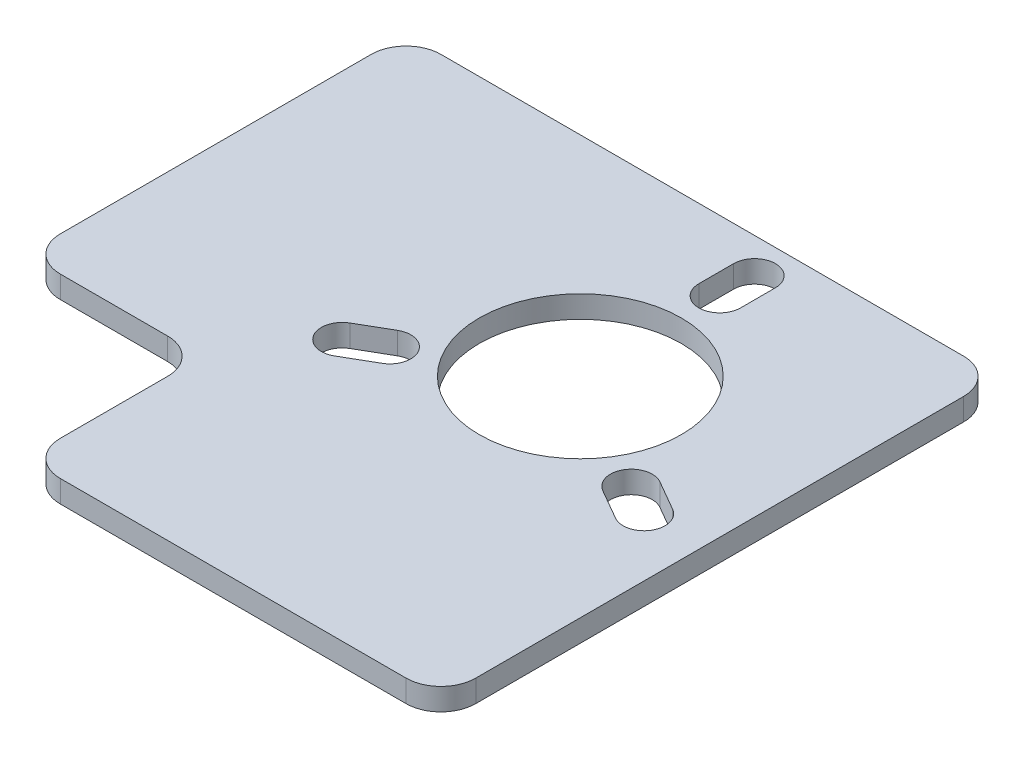
ISO-10303-21;
HEADER;
FILE_DESCRIPTION(('STEP AP214'),'2;1');
FILE_NAME('part.step','',(''),(''),'','','');
FILE_SCHEMA(('AUTOMOTIVE_DESIGN { 1 0 10303 214 1 1 1 1 }'));
ENDSEC;
DATA;
#1=APPLICATION_CONTEXT('core data for automotive mechanical design processes');
#2=APPLICATION_PROTOCOL_DEFINITION('international standard','automotive_design',2000,#1);
#3=PRODUCT_CONTEXT('',#1,'mechanical');
#4=PRODUCT('Part','Part','',(#3));
#5=PRODUCT_RELATED_PRODUCT_CATEGORY('part','',(#4));
#6=PRODUCT_DEFINITION_FORMATION('','',#4);
#7=PRODUCT_DEFINITION_CONTEXT('part definition',#1,'design');
#8=PRODUCT_DEFINITION('design','',#6,#7);
#9=PRODUCT_DEFINITION_SHAPE('','',#8);
#10=(LENGTH_UNIT() NAMED_UNIT(*) SI_UNIT(.MILLI.,.METRE.));
#11=(NAMED_UNIT(*) PLANE_ANGLE_UNIT() SI_UNIT($,.RADIAN.));
#12=(NAMED_UNIT(*) SI_UNIT($,.STERADIAN.) SOLID_ANGLE_UNIT());
#13=UNCERTAINTY_MEASURE_WITH_UNIT(LENGTH_MEASURE(1.E-05),#10,'distance_accuracy_value','');
#14=(GEOMETRIC_REPRESENTATION_CONTEXT(3) GLOBAL_UNCERTAINTY_ASSIGNED_CONTEXT((#13)) GLOBAL_UNIT_ASSIGNED_CONTEXT((#10,
#11,#12)) REPRESENTATION_CONTEXT('',''));
#15=CARTESIAN_POINT('',(0.,0.,0.));
#16=DIRECTION('',(0.,0.,1.));
#17=DIRECTION('',(1.,0.,0.));
#18=AXIS2_PLACEMENT_3D('',#15,#16,#17);
#19=CARTESIAN_POINT('',(0.,6.35,0.));
#20=DIRECTION('',(0.,-1.,0.));
#21=DIRECTION('',(0.,0.,-1.));
#22=AXIS2_PLACEMENT_3D('',#19,#20,#21);
#23=PLANE('',#22);
#24=DIRECTION('',(0.866025403784442,0.,-0.499999999999995));
#25=VECTOR('',#24,1.);
#26=CARTESIAN_POINT('',(69.6987298107779,6.35,-69.8038475772936));
#27=LINE('',#26,#25);
#28=CARTESIAN_POINT('',(69.6987298107779,6.35,-69.8038475772936));
#29=VERTEX_POINT('',#28);
#30=CARTESIAN_POINT('',(78.3589838486223,6.35,-74.8038475772936));
#31=VERTEX_POINT('',#30);
#32=EDGE_CURVE('E243',#29,#31,#27,.T.);
#33=ORIENTED_EDGE('',*,*,#32,.F.);
#34=CARTESIAN_POINT('',(66.6987298107779,6.35,-75.0000000000002));
#35=DIRECTION('',(0.,1.,0.));
#36=DIRECTION('',(0.,0.,1.));
#37=AXIS2_PLACEMENT_3D('',#34,#35,#36);
#38=CIRCLE('',#37,5.99999999999999);
#39=CARTESIAN_POINT('',(63.698729810778,6.35,-80.1961524227069));
#40=VERTEX_POINT('',#39);
#41=EDGE_CURVE('E61',#40,#29,#38,.T.);
#42=ORIENTED_EDGE('',*,*,#41,.F.);
#43=DIRECTION('',(-0.866025403784441,0.,0.499999999999996));
#44=VECTOR('',#43,1.);
#45=CARTESIAN_POINT('',(63.698729810778,6.35,-80.1961524227069));
#46=LINE('',#45,#44);
#47=CARTESIAN_POINT('',(72.3589838486224,6.35,-85.1961524227069));
#48=VERTEX_POINT('',#47);
#49=EDGE_CURVE('E230',#48,#40,#46,.T.);
#50=ORIENTED_EDGE('',*,*,#49,.F.);
#51=CARTESIAN_POINT('',(75.3589838486224,6.35,-80.0000000000002));
#52=DIRECTION('',(0.,1.,0.));
#53=DIRECTION('',(0.,0.,1.));
#54=AXIS2_PLACEMENT_3D('',#51,#52,#53);
#55=CIRCLE('',#54,6.);
#56=EDGE_CURVE('E234',#31,#48,#55,.T.);
#57=ORIENTED_EDGE('',*,*,#56,.F.);
#58=EDGE_LOOP('',(#33,#42,#50,#57));
#59=FACE_BOUND('',#58,.T.);
#60=DIRECTION('',(-0.866025403784439,0.,-0.499999999999999));
#61=VECTOR('',#60,1.);
#62=CARTESIAN_POINT('',(156.301270189222,6.35,-80.1961524227066));
#63=LINE('',#62,#61);
#64=CARTESIAN_POINT('',(156.301270189222,6.35,-80.1961524227066));
#65=VERTEX_POINT('',#64);
#66=CARTESIAN_POINT('',(147.641016151378,6.35,-85.1961524227066));
#67=VERTEX_POINT('',#66);
#68=EDGE_CURVE('E281',#65,#67,#63,.T.);
#69=ORIENTED_EDGE('',*,*,#68,.F.);
#70=CARTESIAN_POINT('',(153.301270189222,6.35,-74.9999999999999));
#71=DIRECTION('',(0.,1.,0.));
#72=DIRECTION('',(0.,0.,1.));
#73=AXIS2_PLACEMENT_3D('',#70,#71,#72);
#74=CIRCLE('',#73,6.00000000000006);
#75=CARTESIAN_POINT('',(150.301270189222,6.35,-69.8038475772933));
#76=VERTEX_POINT('',#75);
#77=EDGE_CURVE('E69',#76,#65,#74,.T.);
#78=ORIENTED_EDGE('',*,*,#77,.F.);
#79=DIRECTION('',(0.866025403784436,0.,0.500000000000004));
#80=VECTOR('',#79,1.);
#81=CARTESIAN_POINT('',(150.301270189222,6.35,-69.8038475772933));
#82=LINE('',#81,#80);
#83=CARTESIAN_POINT('',(141.641016151378,6.35,-74.8038475772933));
#84=VERTEX_POINT('',#83);
#85=EDGE_CURVE('E272',#84,#76,#82,.T.);
#86=ORIENTED_EDGE('',*,*,#85,.F.);
#87=CARTESIAN_POINT('',(144.641016151378,6.35,-80.));
#88=DIRECTION('',(0.,1.,0.));
#89=DIRECTION('',(0.,0.,1.));
#90=AXIS2_PLACEMENT_3D('',#87,#88,#89);
#91=CIRCLE('',#90,6.00000000000002);
#92=EDGE_CURVE('E276',#67,#84,#91,.T.);
#93=ORIENTED_EDGE('',*,*,#92,.F.);
#94=EDGE_LOOP('',(#69,#78,#86,#93));
#95=FACE_BOUND('',#94,.T.);
#96=DIRECTION('',(0.,0.,1.));
#97=VECTOR('',#96,1.);
#98=CARTESIAN_POINT('',(104.,6.35,-150.));
#99=LINE('',#98,#97);
#100=CARTESIAN_POINT('',(104.,6.35,-150.));
#101=VERTEX_POINT('',#100);
#102=CARTESIAN_POINT('',(104.,6.35,-140.));
#103=VERTEX_POINT('',#102);
#104=EDGE_CURVE('E324',#101,#103,#99,.T.);
#105=ORIENTED_EDGE('',*,*,#104,.F.);
#106=CARTESIAN_POINT('',(110.,6.35,-150.));
#107=DIRECTION('',(0.,1.,0.));
#108=DIRECTION('',(0.,0.,1.));
#109=AXIS2_PLACEMENT_3D('',#106,#107,#108);
#110=CIRCLE('',#109,6.00000000000001);
#111=CARTESIAN_POINT('',(116.,6.35,-150.));
#112=VERTEX_POINT('',#111);
#113=EDGE_CURVE('E271',#112,#101,#110,.T.);
#114=ORIENTED_EDGE('',*,*,#113,.F.);
#115=DIRECTION('',(0.,0.,-1.));
#116=VECTOR('',#115,1.);
#117=CARTESIAN_POINT('',(116.,6.35,-150.));
#118=LINE('',#117,#116);
#119=CARTESIAN_POINT('',(116.,6.35,-140.));
#120=VERTEX_POINT('',#119);
#121=EDGE_CURVE('E315',#120,#112,#118,.T.);
#122=ORIENTED_EDGE('',*,*,#121,.F.);
#123=CARTESIAN_POINT('',(110.,6.35,-140.));
#124=DIRECTION('',(0.,1.,0.));
#125=DIRECTION('',(0.,0.,1.));
#126=AXIS2_PLACEMENT_3D('',#123,#124,#125);
#127=CIRCLE('',#126,6.00000000000001);
#128=EDGE_CURVE('E319',#103,#120,#127,.T.);
#129=ORIENTED_EDGE('',*,*,#128,.F.);
#130=EDGE_LOOP('',(#105,#114,#122,#129));
#131=FACE_BOUND('',#130,.T.);
#132=DIRECTION('',(0.,0.,-1.));
#133=VECTOR('',#132,1.);
#134=CARTESIAN_POINT('',(170.,6.35,0.));
#135=LINE('',#134,#133);
#136=CARTESIAN_POINT('',(170.,6.35,-10.));
#137=VERTEX_POINT('',#136);
#138=CARTESIAN_POINT('',(170.,6.35,-150.));
#139=VERTEX_POINT('',#138);
#140=EDGE_CURVE('E377',#137,#139,#135,.T.);
#141=ORIENTED_EDGE('',*,*,#140,.T.);
#142=CARTESIAN_POINT('',(160.,6.35,-150.));
#143=DIRECTION('',(0.,-1.,0.));
#144=DIRECTION('',(0.,0.,-1.));
#145=AXIS2_PLACEMENT_3D('',#142,#143,#144);
#146=CIRCLE('',#145,10.);
#147=CARTESIAN_POINT('',(160.,6.35,-160.));
#148=VERTEX_POINT('',#147);
#149=EDGE_CURVE('E440',#139,#148,#146,.F.);
#150=ORIENTED_EDGE('',*,*,#149,.T.);
#151=DIRECTION('',(-1.,0.,0.));
#152=VECTOR('',#151,1.);
#153=CARTESIAN_POINT('',(0.,6.35,-160.));
#154=LINE('',#153,#152);
#155=CARTESIAN_POINT('',(10.,6.35,-160.));
#156=VERTEX_POINT('',#155);
#157=EDGE_CURVE('E381',#148,#156,#154,.T.);
#158=ORIENTED_EDGE('',*,*,#157,.T.);
#159=CARTESIAN_POINT('',(10.,6.35,-150.));
#160=DIRECTION('',(0.,-1.,0.));
#161=DIRECTION('',(0.,0.,-1.));
#162=AXIS2_PLACEMENT_3D('',#159,#160,#161);
#163=CIRCLE('',#162,10.);
#164=CARTESIAN_POINT('',(0.,6.35,-150.));
#165=VERTEX_POINT('',#164);
#166=EDGE_CURVE('E434',#156,#165,#163,.F.);
#167=ORIENTED_EDGE('',*,*,#166,.T.);
#168=DIRECTION('',(0.,0.,1.));
#169=VECTOR('',#168,1.);
#170=CARTESIAN_POINT('',(0.,6.35,0.));
#171=LINE('',#170,#169);
#172=CARTESIAN_POINT('',(0.,6.35,-60.8));
#173=VERTEX_POINT('',#172);
#174=EDGE_CURVE('E368',#165,#173,#171,.T.);
#175=ORIENTED_EDGE('',*,*,#174,.T.);
#176=CARTESIAN_POINT('',(10.,6.35,-60.8));
#177=DIRECTION('',(0.,-1.,0.));
#178=DIRECTION('',(0.,0.,-1.));
#179=AXIS2_PLACEMENT_3D('',#176,#177,#178);
#180=CIRCLE('',#179,10.);
#181=CARTESIAN_POINT('',(10.,6.35,-50.8));
#182=VERTEX_POINT('',#181);
#183=EDGE_CURVE('E428',#173,#182,#180,.F.);
#184=ORIENTED_EDGE('',*,*,#183,.T.);
#185=DIRECTION('',(-1.,0.,0.));
#186=VECTOR('',#185,1.);
#187=CARTESIAN_POINT('',(0.,6.35,-50.8));
#188=LINE('',#187,#186);
#189=CARTESIAN_POINT('',(40.8,6.35,-50.8));
#190=VERTEX_POINT('',#189);
#191=EDGE_CURVE('E349',#190,#182,#188,.T.);
#192=ORIENTED_EDGE('',*,*,#191,.F.);
#193=CARTESIAN_POINT('',(40.8,6.35,-40.8));
#194=DIRECTION('',(0.,-1.,0.));
#195=DIRECTION('',(0.,0.,-1.));
#196=AXIS2_PLACEMENT_3D('',#193,#194,#195);
#197=CIRCLE('',#196,10.);
#198=CARTESIAN_POINT('',(50.8,6.35,-40.8));
#199=VERTEX_POINT('',#198);
#200=EDGE_CURVE('E54',#190,#199,#197,.T.);
#201=ORIENTED_EDGE('',*,*,#200,.T.);
#202=DIRECTION('',(0.,0.,-1.));
#203=VECTOR('',#202,1.);
#204=CARTESIAN_POINT('',(50.8,6.35,0.));
#205=LINE('',#204,#203);
#206=CARTESIAN_POINT('',(50.8,6.35,-10.));
#207=VERTEX_POINT('',#206);
#208=EDGE_CURVE('E252',#207,#199,#205,.T.);
#209=ORIENTED_EDGE('',*,*,#208,.F.);
#210=CARTESIAN_POINT('',(60.8,6.35,-10.));
#211=DIRECTION('',(0.,-1.,0.));
#212=DIRECTION('',(0.,0.,-1.));
#213=AXIS2_PLACEMENT_3D('',#210,#211,#212);
#214=CIRCLE('',#213,10.);
#215=CARTESIAN_POINT('',(60.8,6.35,0.));
#216=VERTEX_POINT('',#215);
#217=EDGE_CURVE('E431',#207,#216,#214,.F.);
#218=ORIENTED_EDGE('',*,*,#217,.T.);
#219=DIRECTION('',(1.,0.,0.));
#220=VECTOR('',#219,1.);
#221=CARTESIAN_POINT('',(0.,6.35,0.));
#222=LINE('',#221,#220);
#223=CARTESIAN_POINT('',(160.,6.35,0.));
#224=VERTEX_POINT('',#223);
#225=EDGE_CURVE('E372',#216,#224,#222,.T.);
#226=ORIENTED_EDGE('',*,*,#225,.T.);
#227=CARTESIAN_POINT('',(160.,6.35,-10.));
#228=DIRECTION('',(0.,-1.,0.));
#229=DIRECTION('',(0.,0.,-1.));
#230=AXIS2_PLACEMENT_3D('',#227,#228,#229);
#231=CIRCLE('',#230,10.);
#232=EDGE_CURVE('E437',#224,#137,#231,.F.);
#233=ORIENTED_EDGE('',*,*,#232,.T.);
#234=EDGE_LOOP('',(#141,#150,#158,#167,#175,#184,#192,#201,#209,#218,#226,#233));
#235=FACE_BOUND('',#234,.T.);
#236=CARTESIAN_POINT('',(110.,6.35,-100.));
#237=DIRECTION('',(0.,1.,0.));
#238=DIRECTION('',(0.,0.,1.));
#239=AXIS2_PLACEMENT_3D('',#236,#237,#238);
#240=CIRCLE('',#239,29.);
#241=CARTESIAN_POINT('',(110.,6.35,-71.));
#242=VERTEX_POINT('',#241);
#243=EDGE_CURVE('E360',#242,#242,#240,.T.);
#244=ORIENTED_EDGE('',*,*,#243,.F.);
#245=EDGE_LOOP('',(#244));
#246=FACE_BOUND('',#245,.T.);
#247=ADVANCED_FACE('F45',(#59,#95,#131,#235,#246),#23,.F.);
#248=CARTESIAN_POINT('',(0.,0.,0.));
#249=DIRECTION('',(0.,-1.,0.));
#250=DIRECTION('',(0.,0.,-1.));
#251=AXIS2_PLACEMENT_3D('',#248,#249,#250);
#252=PLANE('',#251);
#253=CARTESIAN_POINT('',(66.6987298107779,0.,-75.0000000000002));
#254=DIRECTION('',(0.,1.,0.));
#255=DIRECTION('',(0.,0.,1.));
#256=AXIS2_PLACEMENT_3D('',#253,#254,#255);
#257=CIRCLE('',#256,5.99999999999999);
#258=CARTESIAN_POINT('',(63.698729810778,0.,-80.1961524227069));
#259=VERTEX_POINT('',#258);
#260=CARTESIAN_POINT('',(69.6987298107779,0.,-69.8038475772936));
#261=VERTEX_POINT('',#260);
#262=EDGE_CURVE('E208',#259,#261,#257,.T.);
#263=ORIENTED_EDGE('',*,*,#262,.T.);
#264=DIRECTION('',(0.866025403784442,0.,-0.499999999999995));
#265=VECTOR('',#264,1.);
#266=CARTESIAN_POINT('',(69.6987298107779,0.,-69.8038475772936));
#267=LINE('',#266,#265);
#268=CARTESIAN_POINT('',(78.3589838486223,0.,-74.8038475772936));
#269=VERTEX_POINT('',#268);
#270=EDGE_CURVE('E219',#261,#269,#267,.T.);
#271=ORIENTED_EDGE('',*,*,#270,.T.);
#272=CARTESIAN_POINT('',(75.3589838486224,0.,-80.0000000000002));
#273=DIRECTION('',(0.,1.,0.));
#274=DIRECTION('',(0.,0.,1.));
#275=AXIS2_PLACEMENT_3D('',#272,#273,#274);
#276=CIRCLE('',#275,6.);
#277=CARTESIAN_POINT('',(72.3589838486224,0.,-85.1961524227069));
#278=VERTEX_POINT('',#277);
#279=EDGE_CURVE('E224',#269,#278,#276,.T.);
#280=ORIENTED_EDGE('',*,*,#279,.T.);
#281=DIRECTION('',(-0.866025403784441,0.,0.499999999999996));
#282=VECTOR('',#281,1.);
#283=CARTESIAN_POINT('',(63.698729810778,0.,-80.1961524227069));
#284=LINE('',#283,#282);
#285=EDGE_CURVE('E215',#278,#259,#284,.T.);
#286=ORIENTED_EDGE('',*,*,#285,.T.);
#287=EDGE_LOOP('',(#263,#271,#280,#286));
#288=FACE_BOUND('',#287,.T.);
#289=CARTESIAN_POINT('',(153.301270189222,0.,-74.9999999999999));
#290=DIRECTION('',(0.,1.,0.));
#291=DIRECTION('',(0.,0.,1.));
#292=AXIS2_PLACEMENT_3D('',#289,#290,#291);
#293=CIRCLE('',#292,6.00000000000006);
#294=CARTESIAN_POINT('',(150.301270189222,0.,-69.8038475772933));
#295=VERTEX_POINT('',#294);
#296=CARTESIAN_POINT('',(156.301270189222,0.,-80.1961524227066));
#297=VERTEX_POINT('',#296);
#298=EDGE_CURVE('E277',#295,#297,#293,.T.);
#299=ORIENTED_EDGE('',*,*,#298,.T.);
#300=DIRECTION('',(-0.866025403784439,0.,-0.499999999999999));
#301=VECTOR('',#300,1.);
#302=CARTESIAN_POINT('',(156.301270189222,0.,-80.1961524227066));
#303=LINE('',#302,#301);
#304=CARTESIAN_POINT('',(147.641016151378,0.,-85.1961524227066));
#305=VERTEX_POINT('',#304);
#306=EDGE_CURVE('E294',#297,#305,#303,.T.);
#307=ORIENTED_EDGE('',*,*,#306,.T.);
#308=CARTESIAN_POINT('',(144.641016151378,0.,-80.));
#309=DIRECTION('',(0.,1.,0.));
#310=DIRECTION('',(0.,0.,1.));
#311=AXIS2_PLACEMENT_3D('',#308,#309,#310);
#312=CIRCLE('',#311,6.00000000000002);
#313=CARTESIAN_POINT('',(141.641016151378,0.,-74.8038475772933));
#314=VERTEX_POINT('',#313);
#315=EDGE_CURVE('E290',#305,#314,#312,.T.);
#316=ORIENTED_EDGE('',*,*,#315,.T.);
#317=DIRECTION('',(0.866025403784436,0.,0.500000000000004));
#318=VECTOR('',#317,1.);
#319=CARTESIAN_POINT('',(150.301270189222,0.,-69.8038475772933));
#320=LINE('',#319,#318);
#321=EDGE_CURVE('E261',#314,#295,#320,.T.);
#322=ORIENTED_EDGE('',*,*,#321,.T.);
#323=EDGE_LOOP('',(#299,#307,#316,#322));
#324=FACE_BOUND('',#323,.T.);
#325=CARTESIAN_POINT('',(110.,0.,-150.));
#326=DIRECTION('',(0.,1.,0.));
#327=DIRECTION('',(0.,0.,1.));
#328=AXIS2_PLACEMENT_3D('',#325,#326,#327);
#329=CIRCLE('',#328,6.00000000000001);
#330=CARTESIAN_POINT('',(116.,0.,-150.));
#331=VERTEX_POINT('',#330);
#332=CARTESIAN_POINT('',(104.,0.,-150.));
#333=VERTEX_POINT('',#332);
#334=EDGE_CURVE('E320',#331,#333,#329,.T.);
#335=ORIENTED_EDGE('',*,*,#334,.T.);
#336=DIRECTION('',(0.,0.,1.));
#337=VECTOR('',#336,1.);
#338=CARTESIAN_POINT('',(104.,0.,-150.));
#339=LINE('',#338,#337);
#340=CARTESIAN_POINT('',(104.,0.,-140.));
#341=VERTEX_POINT('',#340);
#342=EDGE_CURVE('E337',#333,#341,#339,.T.);
#343=ORIENTED_EDGE('',*,*,#342,.T.);
#344=CARTESIAN_POINT('',(110.,0.,-140.));
#345=DIRECTION('',(0.,1.,0.));
#346=DIRECTION('',(0.,0.,1.));
#347=AXIS2_PLACEMENT_3D('',#344,#345,#346);
#348=CIRCLE('',#347,6.00000000000001);
#349=CARTESIAN_POINT('',(116.,0.,-140.));
#350=VERTEX_POINT('',#349);
#351=EDGE_CURVE('E333',#341,#350,#348,.T.);
#352=ORIENTED_EDGE('',*,*,#351,.T.);
#353=DIRECTION('',(0.,0.,-1.));
#354=VECTOR('',#353,1.);
#355=CARTESIAN_POINT('',(116.,0.,-150.));
#356=LINE('',#355,#354);
#357=EDGE_CURVE('E305',#350,#331,#356,.T.);
#358=ORIENTED_EDGE('',*,*,#357,.T.);
#359=EDGE_LOOP('',(#335,#343,#352,#358));
#360=FACE_BOUND('',#359,.T.);
#361=DIRECTION('',(-1.,0.,0.));
#362=VECTOR('',#361,1.);
#363=CARTESIAN_POINT('',(0.,0.,-160.));
#364=LINE('',#363,#362);
#365=CARTESIAN_POINT('',(160.,0.,-160.));
#366=VERTEX_POINT('',#365);
#367=CARTESIAN_POINT('',(10.,0.,-160.));
#368=VERTEX_POINT('',#367);
#369=EDGE_CURVE('E373',#366,#368,#364,.T.);
#370=ORIENTED_EDGE('',*,*,#369,.F.);
#371=CARTESIAN_POINT('',(160.,0.,-150.));
#372=DIRECTION('',(0.,-1.,0.));
#373=DIRECTION('',(0.,0.,-1.));
#374=AXIS2_PLACEMENT_3D('',#371,#372,#373);
#375=CIRCLE('',#374,10.);
#376=CARTESIAN_POINT('',(170.,0.,-150.));
#377=VERTEX_POINT('',#376);
#378=EDGE_CURVE('E418',#366,#377,#375,.T.);
#379=ORIENTED_EDGE('',*,*,#378,.T.);
#380=DIRECTION('',(0.,0.,-1.));
#381=VECTOR('',#380,1.);
#382=CARTESIAN_POINT('',(170.,0.,0.));
#383=LINE('',#382,#381);
#384=CARTESIAN_POINT('',(170.,0.,-10.));
#385=VERTEX_POINT('',#384);
#386=EDGE_CURVE('E393',#385,#377,#383,.T.);
#387=ORIENTED_EDGE('',*,*,#386,.F.);
#388=CARTESIAN_POINT('',(160.,0.,-10.));
#389=DIRECTION('',(0.,-1.,0.));
#390=DIRECTION('',(0.,0.,-1.));
#391=AXIS2_PLACEMENT_3D('',#388,#389,#390);
#392=CIRCLE('',#391,10.);
#393=CARTESIAN_POINT('',(160.,0.,0.));
#394=VERTEX_POINT('',#393);
#395=EDGE_CURVE('E415',#385,#394,#392,.T.);
#396=ORIENTED_EDGE('',*,*,#395,.T.);
#397=DIRECTION('',(1.,0.,0.));
#398=VECTOR('',#397,1.);
#399=CARTESIAN_POINT('',(0.,0.,0.));
#400=LINE('',#399,#398);
#401=CARTESIAN_POINT('',(60.8,0.,0.));
#402=VERTEX_POINT('',#401);
#403=EDGE_CURVE('E389',#402,#394,#400,.T.);
#404=ORIENTED_EDGE('',*,*,#403,.F.);
#405=CARTESIAN_POINT('',(60.8,0.,-10.));
#406=DIRECTION('',(0.,-1.,0.));
#407=DIRECTION('',(0.,0.,-1.));
#408=AXIS2_PLACEMENT_3D('',#405,#406,#407);
#409=CIRCLE('',#408,10.);
#410=CARTESIAN_POINT('',(50.8,0.,-10.));
#411=VERTEX_POINT('',#410);
#412=EDGE_CURVE('E409',#402,#411,#409,.T.);
#413=ORIENTED_EDGE('',*,*,#412,.T.);
#414=DIRECTION('',(0.,0.,-1.));
#415=VECTOR('',#414,1.);
#416=CARTESIAN_POINT('',(50.8,0.,0.));
#417=LINE('',#416,#415);
#418=CARTESIAN_POINT('',(50.8,0.,-40.8));
#419=VERTEX_POINT('',#418);
#420=EDGE_CURVE('E344',#411,#419,#417,.T.);
#421=ORIENTED_EDGE('',*,*,#420,.T.);
#422=CARTESIAN_POINT('',(40.8,0.,-40.8));
#423=DIRECTION('',(0.,-1.,0.));
#424=DIRECTION('',(0.,0.,-1.));
#425=AXIS2_PLACEMENT_3D('',#422,#423,#424);
#426=CIRCLE('',#425,10.);
#427=CARTESIAN_POINT('',(40.8,0.,-50.8));
#428=VERTEX_POINT('',#427);
#429=EDGE_CURVE('E11',#419,#428,#426,.F.);
#430=ORIENTED_EDGE('',*,*,#429,.T.);
#431=DIRECTION('',(-1.,0.,0.));
#432=VECTOR('',#431,1.);
#433=CARTESIAN_POINT('',(0.,0.,-50.8));
#434=LINE('',#433,#432);
#435=CARTESIAN_POINT('',(10.,0.,-50.8));
#436=VERTEX_POINT('',#435);
#437=EDGE_CURVE('E348',#428,#436,#434,.T.);
#438=ORIENTED_EDGE('',*,*,#437,.T.);
#439=CARTESIAN_POINT('',(10.,0.,-60.8));
#440=DIRECTION('',(0.,-1.,0.));
#441=DIRECTION('',(0.,0.,-1.));
#442=AXIS2_PLACEMENT_3D('',#439,#440,#441);
#443=CIRCLE('',#442,10.);
#444=CARTESIAN_POINT('',(0.,0.,-60.8));
#445=VERTEX_POINT('',#444);
#446=EDGE_CURVE('E406',#436,#445,#443,.T.);
#447=ORIENTED_EDGE('',*,*,#446,.T.);
#448=DIRECTION('',(0.,0.,1.));
#449=VECTOR('',#448,1.);
#450=CARTESIAN_POINT('',(0.,0.,0.));
#451=LINE('',#450,#449);
#452=CARTESIAN_POINT('',(0.,0.,-150.));
#453=VERTEX_POINT('',#452);
#454=EDGE_CURVE('E364',#453,#445,#451,.T.);
#455=ORIENTED_EDGE('',*,*,#454,.F.);
#456=CARTESIAN_POINT('',(10.,0.,-150.));
#457=DIRECTION('',(0.,-1.,0.));
#458=DIRECTION('',(0.,0.,-1.));
#459=AXIS2_PLACEMENT_3D('',#456,#457,#458);
#460=CIRCLE('',#459,10.);
#461=EDGE_CURVE('E412',#453,#368,#460,.T.);
#462=ORIENTED_EDGE('',*,*,#461,.T.);
#463=EDGE_LOOP('',(#370,#379,#387,#396,#404,#413,#421,#430,#438,#447,#455,#462));
#464=FACE_BOUND('',#463,.T.);
#465=CARTESIAN_POINT('',(110.,0.,-100.));
#466=DIRECTION('',(0.,1.,0.));
#467=DIRECTION('',(0.,0.,1.));
#468=AXIS2_PLACEMENT_3D('',#465,#466,#467);
#469=CIRCLE('',#468,29.);
#470=CARTESIAN_POINT('',(110.,0.,-71.));
#471=VERTEX_POINT('',#470);
#472=EDGE_CURVE('E353',#471,#471,#469,.T.);
#473=ORIENTED_EDGE('',*,*,#472,.T.);
#474=EDGE_LOOP('',(#473));
#475=FACE_BOUND('',#474,.T.);
#476=ADVANCED_FACE('F226',(#288,#324,#360,#464,#475),#252,.T.);
#477=CARTESIAN_POINT('',(0.,6.35,0.));
#478=DIRECTION('',(1.,0.,0.));
#479=DIRECTION('',(0.,0.,-1.));
#480=AXIS2_PLACEMENT_3D('',#477,#478,#479);
#481=PLANE('',#480);
#482=ORIENTED_EDGE('',*,*,#174,.F.);
#483=DIRECTION('',(0.,-1.,0.));
#484=VECTOR('',#483,1.);
#485=CARTESIAN_POINT('',(0.,6.35,-150.));
#486=LINE('',#485,#484);
#487=EDGE_CURVE('E453',#165,#453,#486,.T.);
#488=ORIENTED_EDGE('',*,*,#487,.T.);
#489=ORIENTED_EDGE('',*,*,#454,.T.);
#490=DIRECTION('',(0.,1.,0.));
#491=VECTOR('',#490,1.);
#492=CARTESIAN_POINT('',(0.,6.35,-60.8));
#493=LINE('',#492,#491);
#494=EDGE_CURVE('E449',#445,#173,#493,.T.);
#495=ORIENTED_EDGE('',*,*,#494,.T.);
#496=EDGE_LOOP('',(#482,#488,#489,#495));
#497=FACE_BOUND('',#496,.T.);
#498=ADVANCED_FACE('F497',(#497),#481,.F.);
#499=CARTESIAN_POINT('',(0.,6.35,0.));
#500=DIRECTION('',(0.,0.,-1.));
#501=DIRECTION('',(-1.,0.,0.));
#502=AXIS2_PLACEMENT_3D('',#499,#500,#501);
#503=PLANE('',#502);
#504=ORIENTED_EDGE('',*,*,#403,.T.);
#505=DIRECTION('',(0.,-1.,0.));
#506=VECTOR('',#505,1.);
#507=CARTESIAN_POINT('',(160.,6.35,0.));
#508=LINE('',#507,#506);
#509=EDGE_CURVE('E446',#394,#224,#508,.F.);
#510=ORIENTED_EDGE('',*,*,#509,.T.);
#511=ORIENTED_EDGE('',*,*,#225,.F.);
#512=DIRECTION('',(0.,1.,0.));
#513=VECTOR('',#512,1.);
#514=CARTESIAN_POINT('',(60.8,6.35,0.));
#515=LINE('',#514,#513);
#516=EDGE_CURVE('E443',#216,#402,#515,.F.);
#517=ORIENTED_EDGE('',*,*,#516,.T.);
#518=EDGE_LOOP('',(#504,#510,#511,#517));
#519=FACE_BOUND('',#518,.T.);
#520=ADVANCED_FACE('F523',(#519),#503,.F.);
#521=CARTESIAN_POINT('',(170.,6.35,0.));
#522=DIRECTION('',(-1.,0.,0.));
#523=DIRECTION('',(0.,0.,1.));
#524=AXIS2_PLACEMENT_3D('',#521,#522,#523);
#525=PLANE('',#524);
#526=ORIENTED_EDGE('',*,*,#386,.T.);
#527=DIRECTION('',(0.,-1.,0.));
#528=VECTOR('',#527,1.);
#529=CARTESIAN_POINT('',(170.,6.35,-150.));
#530=LINE('',#529,#528);
#531=EDGE_CURVE('E425',#377,#139,#530,.F.);
#532=ORIENTED_EDGE('',*,*,#531,.T.);
#533=ORIENTED_EDGE('',*,*,#140,.F.);
#534=DIRECTION('',(0.,-1.,0.));
#535=VECTOR('',#534,1.);
#536=CARTESIAN_POINT('',(170.,6.35,-10.));
#537=LINE('',#536,#535);
#538=EDGE_CURVE('E421',#137,#385,#537,.T.);
#539=ORIENTED_EDGE('',*,*,#538,.T.);
#540=EDGE_LOOP('',(#526,#532,#533,#539));
#541=FACE_BOUND('',#540,.T.);
#542=ADVANCED_FACE('F513',(#541),#525,.F.);
#543=CARTESIAN_POINT('',(0.,6.35,-160.));
#544=DIRECTION('',(0.,0.,1.));
#545=DIRECTION('',(1.,0.,0.));
#546=AXIS2_PLACEMENT_3D('',#543,#544,#545);
#547=PLANE('',#546);
#548=ORIENTED_EDGE('',*,*,#157,.F.);
#549=DIRECTION('',(0.,-1.,0.));
#550=VECTOR('',#549,1.);
#551=CARTESIAN_POINT('',(160.,6.35,-160.));
#552=LINE('',#551,#550);
#553=EDGE_CURVE('E402',#148,#366,#552,.T.);
#554=ORIENTED_EDGE('',*,*,#553,.T.);
#555=ORIENTED_EDGE('',*,*,#369,.T.);
#556=DIRECTION('',(0.,-1.,0.));
#557=VECTOR('',#556,1.);
#558=CARTESIAN_POINT('',(10.,6.35,-160.));
#559=LINE('',#558,#557);
#560=EDGE_CURVE('E385',#368,#156,#559,.F.);
#561=ORIENTED_EDGE('',*,*,#560,.T.);
#562=EDGE_LOOP('',(#548,#554,#555,#561));
#563=FACE_BOUND('',#562,.T.);
#564=ADVANCED_FACE('F505',(#563),#547,.F.);
#565=CARTESIAN_POINT('',(110.,6.35,-100.));
#566=DIRECTION('',(0.,-1.,0.));
#567=DIRECTION('',(0.,0.,-1.));
#568=AXIS2_PLACEMENT_3D('',#565,#566,#567);
#569=CYLINDRICAL_SURFACE('',#568,29.);
#570=ORIENTED_EDGE('',*,*,#243,.T.);
#571=EDGE_LOOP('',(#570));
#572=FACE_BOUND('',#571,.T.);
#573=ORIENTED_EDGE('',*,*,#472,.F.);
#574=EDGE_LOOP('',(#573));
#575=FACE_BOUND('',#574,.T.);
#576=ADVANCED_FACE('F544',(#572,#575),#569,.F.);
#577=CARTESIAN_POINT('',(0.,0.,-50.8));
#578=DIRECTION('',(0.,0.,-1.));
#579=DIRECTION('',(-1.,0.,0.));
#580=AXIS2_PLACEMENT_3D('',#577,#578,#579);
#581=PLANE('',#580);
#582=ORIENTED_EDGE('',*,*,#437,.F.);
#583=DIRECTION('',(0.,1.,0.));
#584=VECTOR('',#583,1.);
#585=CARTESIAN_POINT('',(40.8,6.35,-50.8));
#586=LINE('',#585,#584);
#587=EDGE_CURVE('E460',#428,#190,#586,.T.);
#588=ORIENTED_EDGE('',*,*,#587,.T.);
#589=ORIENTED_EDGE('',*,*,#191,.T.);
#590=DIRECTION('',(0.,1.,0.));
#591=VECTOR('',#590,1.);
#592=CARTESIAN_POINT('',(10.,0.,-50.8));
#593=LINE('',#592,#591);
#594=EDGE_CURVE('E457',#182,#436,#593,.F.);
#595=ORIENTED_EDGE('',*,*,#594,.T.);
#596=EDGE_LOOP('',(#582,#588,#589,#595));
#597=FACE_BOUND('',#596,.T.);
#598=ADVANCED_FACE('F490',(#597),#581,.F.);
#599=CARTESIAN_POINT('',(50.8,0.,0.));
#600=DIRECTION('',(1.,0.,0.));
#601=DIRECTION('',(0.,0.,-1.));
#602=AXIS2_PLACEMENT_3D('',#599,#600,#601);
#603=PLANE('',#602);
#604=ORIENTED_EDGE('',*,*,#208,.T.);
#605=DIRECTION('',(0.,1.,0.));
#606=VECTOR('',#605,1.);
#607=CARTESIAN_POINT('',(50.8,0.,-40.8));
#608=LINE('',#607,#606);
#609=EDGE_CURVE('E468',#199,#419,#608,.F.);
#610=ORIENTED_EDGE('',*,*,#609,.T.);
#611=ORIENTED_EDGE('',*,*,#420,.F.);
#612=DIRECTION('',(0.,1.,0.));
#613=VECTOR('',#612,1.);
#614=CARTESIAN_POINT('',(50.8,0.,-10.));
#615=LINE('',#614,#613);
#616=EDGE_CURVE('E464',#411,#207,#615,.T.);
#617=ORIENTED_EDGE('',*,*,#616,.T.);
#618=EDGE_LOOP('',(#604,#610,#611,#617));
#619=FACE_BOUND('',#618,.T.);
#620=ADVANCED_FACE('F479',(#619),#603,.F.);
#621=CARTESIAN_POINT('',(160.,6.35,-150.));
#622=DIRECTION('',(0.,-1.,0.));
#623=DIRECTION('',(0.,0.,-1.));
#624=AXIS2_PLACEMENT_3D('',#621,#622,#623);
#625=CYLINDRICAL_SURFACE('',#624,10.);
#626=ORIENTED_EDGE('',*,*,#149,.F.);
#627=ORIENTED_EDGE('',*,*,#531,.F.);
#628=ORIENTED_EDGE('',*,*,#378,.F.);
#629=ORIENTED_EDGE('',*,*,#553,.F.);
#630=EDGE_LOOP('',(#626,#627,#628,#629));
#631=FACE_BOUND('',#630,.T.);
#632=ADVANCED_FACE('F509',(#631),#625,.T.);
#633=CARTESIAN_POINT('',(160.,6.35,-10.));
#634=DIRECTION('',(0.,-1.,0.));
#635=DIRECTION('',(0.,0.,-1.));
#636=AXIS2_PLACEMENT_3D('',#633,#634,#635);
#637=CYLINDRICAL_SURFACE('',#636,10.);
#638=ORIENTED_EDGE('',*,*,#232,.F.);
#639=ORIENTED_EDGE('',*,*,#509,.F.);
#640=ORIENTED_EDGE('',*,*,#395,.F.);
#641=ORIENTED_EDGE('',*,*,#538,.F.);
#642=EDGE_LOOP('',(#638,#639,#640,#641));
#643=FACE_BOUND('',#642,.T.);
#644=ADVANCED_FACE('F518',(#643),#637,.T.);
#645=CARTESIAN_POINT('',(10.,6.35,-150.));
#646=DIRECTION('',(0.,-1.,0.));
#647=DIRECTION('',(0.,0.,-1.));
#648=AXIS2_PLACEMENT_3D('',#645,#646,#647);
#649=CYLINDRICAL_SURFACE('',#648,10.);
#650=ORIENTED_EDGE('',*,*,#166,.F.);
#651=ORIENTED_EDGE('',*,*,#560,.F.);
#652=ORIENTED_EDGE('',*,*,#461,.F.);
#653=ORIENTED_EDGE('',*,*,#487,.F.);
#654=EDGE_LOOP('',(#650,#651,#652,#653));
#655=FACE_BOUND('',#654,.T.);
#656=ADVANCED_FACE('F501',(#655),#649,.T.);
#657=CARTESIAN_POINT('',(40.8,0.,-40.8));
#658=DIRECTION('',(0.,-1.,0.));
#659=DIRECTION('',(0.,0.,-1.));
#660=AXIS2_PLACEMENT_3D('',#657,#658,#659);
#661=CYLINDRICAL_SURFACE('',#660,10.);
#662=ORIENTED_EDGE('',*,*,#429,.F.);
#663=ORIENTED_EDGE('',*,*,#609,.F.);
#664=ORIENTED_EDGE('',*,*,#200,.F.);
#665=ORIENTED_EDGE('',*,*,#587,.F.);
#666=EDGE_LOOP('',(#662,#663,#664,#665));
#667=FACE_BOUND('',#666,.T.);
#668=ADVANCED_FACE('F483',(#667),#661,.F.);
#669=CARTESIAN_POINT('',(60.8,0.,-10.));
#670=DIRECTION('',(0.,1.,0.));
#671=DIRECTION('',(0.,0.,1.));
#672=AXIS2_PLACEMENT_3D('',#669,#670,#671);
#673=CYLINDRICAL_SURFACE('',#672,10.);
#674=ORIENTED_EDGE('',*,*,#412,.F.);
#675=ORIENTED_EDGE('',*,*,#516,.F.);
#676=ORIENTED_EDGE('',*,*,#217,.F.);
#677=ORIENTED_EDGE('',*,*,#616,.F.);
#678=EDGE_LOOP('',(#674,#675,#676,#677));
#679=FACE_BOUND('',#678,.T.);
#680=ADVANCED_FACE('F527',(#679),#673,.T.);
#681=CARTESIAN_POINT('',(10.,6.35,-60.8));
#682=DIRECTION('',(0.,1.,0.));
#683=DIRECTION('',(0.,0.,1.));
#684=AXIS2_PLACEMENT_3D('',#681,#682,#683);
#685=CYLINDRICAL_SURFACE('',#684,10.);
#686=ORIENTED_EDGE('',*,*,#446,.F.);
#687=ORIENTED_EDGE('',*,*,#594,.F.);
#688=ORIENTED_EDGE('',*,*,#183,.F.);
#689=ORIENTED_EDGE('',*,*,#494,.F.);
#690=EDGE_LOOP('',(#686,#687,#688,#689));
#691=FACE_BOUND('',#690,.T.);
#692=ADVANCED_FACE('F47',(#691),#685,.T.);
#693=CARTESIAN_POINT('',(110.,0.,-150.));
#694=DIRECTION('',(0.,1.,0.));
#695=DIRECTION('',(0.,0.,1.));
#696=AXIS2_PLACEMENT_3D('',#693,#694,#695);
#697=CYLINDRICAL_SURFACE('',#696,6.00000000000001);
#698=ORIENTED_EDGE('',*,*,#113,.T.);
#699=DIRECTION('',(0.,1.,0.));
#700=VECTOR('',#699,1.);
#701=CARTESIAN_POINT('',(104.,0.,-150.));
#702=LINE('',#701,#700);
#703=EDGE_CURVE('E301',#333,#101,#702,.T.);
#704=ORIENTED_EDGE('',*,*,#703,.F.);
#705=ORIENTED_EDGE('',*,*,#334,.F.);
#706=DIRECTION('',(0.,1.,0.));
#707=VECTOR('',#706,1.);
#708=CARTESIAN_POINT('',(116.,0.,-150.));
#709=LINE('',#708,#707);
#710=EDGE_CURVE('E312',#331,#112,#709,.T.);
#711=ORIENTED_EDGE('',*,*,#710,.T.);
#712=EDGE_LOOP('',(#698,#704,#705,#711));
#713=FACE_BOUND('',#712,.T.);
#714=ADVANCED_FACE('F533',(#713),#697,.F.);
#715=CARTESIAN_POINT('',(116.,0.,-150.));
#716=DIRECTION('',(1.,0.,0.));
#717=DIRECTION('',(0.,0.,-1.));
#718=AXIS2_PLACEMENT_3D('',#715,#716,#717);
#719=PLANE('',#718);
#720=ORIENTED_EDGE('',*,*,#121,.T.);
#721=ORIENTED_EDGE('',*,*,#710,.F.);
#722=ORIENTED_EDGE('',*,*,#357,.F.);
#723=DIRECTION('',(0.,1.,0.));
#724=VECTOR('',#723,1.);
#725=CARTESIAN_POINT('',(116.,0.,-140.));
#726=LINE('',#725,#724);
#727=EDGE_CURVE('E309',#350,#120,#726,.T.);
#728=ORIENTED_EDGE('',*,*,#727,.T.);
#729=EDGE_LOOP('',(#720,#721,#722,#728));
#730=FACE_BOUND('',#729,.T.);
#731=ADVANCED_FACE('F589',(#730),#719,.F.);
#732=CARTESIAN_POINT('',(110.,0.,-140.));
#733=DIRECTION('',(0.,1.,0.));
#734=DIRECTION('',(0.,0.,1.));
#735=AXIS2_PLACEMENT_3D('',#732,#733,#734);
#736=CYLINDRICAL_SURFACE('',#735,6.00000000000001);
#737=ORIENTED_EDGE('',*,*,#128,.T.);
#738=ORIENTED_EDGE('',*,*,#727,.F.);
#739=ORIENTED_EDGE('',*,*,#351,.F.);
#740=DIRECTION('',(0.,1.,0.));
#741=VECTOR('',#740,1.);
#742=CARTESIAN_POINT('',(104.,0.,-140.));
#743=LINE('',#742,#741);
#744=EDGE_CURVE('E306',#341,#103,#743,.T.);
#745=ORIENTED_EDGE('',*,*,#744,.T.);
#746=EDGE_LOOP('',(#737,#738,#739,#745));
#747=FACE_BOUND('',#746,.T.);
#748=ADVANCED_FACE('F599',(#747),#736,.F.);
#749=CARTESIAN_POINT('',(104.,0.,-150.));
#750=DIRECTION('',(-1.,0.,0.));
#751=DIRECTION('',(0.,0.,1.));
#752=AXIS2_PLACEMENT_3D('',#749,#750,#751);
#753=PLANE('',#752);
#754=ORIENTED_EDGE('',*,*,#104,.T.);
#755=ORIENTED_EDGE('',*,*,#744,.F.);
#756=ORIENTED_EDGE('',*,*,#342,.F.);
#757=ORIENTED_EDGE('',*,*,#703,.T.);
#758=EDGE_LOOP('',(#754,#755,#756,#757));
#759=FACE_BOUND('',#758,.T.);
#760=ADVANCED_FACE('F609',(#759),#753,.F.);
#761=CARTESIAN_POINT('',(153.301270189222,0.,-74.9999999999999));
#762=DIRECTION('',(0.,1.,0.));
#763=DIRECTION('',(0.,0.,1.));
#764=AXIS2_PLACEMENT_3D('',#761,#762,#763);
#765=CYLINDRICAL_SURFACE('',#764,6.00000000000006);
#766=ORIENTED_EDGE('',*,*,#77,.T.);
#767=DIRECTION('',(0.,1.,0.));
#768=VECTOR('',#767,1.);
#769=CARTESIAN_POINT('',(156.301270189222,0.,-80.1961524227066));
#770=LINE('',#769,#768);
#771=EDGE_CURVE('E258',#297,#65,#770,.T.);
#772=ORIENTED_EDGE('',*,*,#771,.F.);
#773=ORIENTED_EDGE('',*,*,#298,.F.);
#774=DIRECTION('',(0.,1.,0.));
#775=VECTOR('',#774,1.);
#776=CARTESIAN_POINT('',(150.301270189222,0.,-69.8038475772933));
#777=LINE('',#776,#775);
#778=EDGE_CURVE('E268',#295,#76,#777,.T.);
#779=ORIENTED_EDGE('',*,*,#778,.T.);
#780=EDGE_LOOP('',(#766,#772,#773,#779));
#781=FACE_BOUND('',#780,.T.);
#782=ADVANCED_FACE('F619',(#781),#765,.F.);
#783=CARTESIAN_POINT('',(150.301270189222,0.,-69.8038475772933));
#784=DIRECTION('',(-0.500000000000004,0.,0.866025403784436));
#785=DIRECTION('',(0.866025403784436,0.,0.500000000000004));
#786=AXIS2_PLACEMENT_3D('',#783,#784,#785);
#787=PLANE('',#786);
#788=ORIENTED_EDGE('',*,*,#85,.T.);
#789=ORIENTED_EDGE('',*,*,#778,.F.);
#790=ORIENTED_EDGE('',*,*,#321,.F.);
#791=DIRECTION('',(0.,1.,0.));
#792=VECTOR('',#791,1.);
#793=CARTESIAN_POINT('',(141.641016151378,0.,-74.8038475772933));
#794=LINE('',#793,#792);
#795=EDGE_CURVE('E265',#314,#84,#794,.T.);
#796=ORIENTED_EDGE('',*,*,#795,.T.);
#797=EDGE_LOOP('',(#788,#789,#790,#796));
#798=FACE_BOUND('',#797,.T.);
#799=ADVANCED_FACE('F629',(#798),#787,.F.);
#800=CARTESIAN_POINT('',(144.641016151378,0.,-80.));
#801=DIRECTION('',(0.,1.,0.));
#802=DIRECTION('',(0.,0.,1.));
#803=AXIS2_PLACEMENT_3D('',#800,#801,#802);
#804=CYLINDRICAL_SURFACE('',#803,6.00000000000002);
#805=ORIENTED_EDGE('',*,*,#92,.T.);
#806=ORIENTED_EDGE('',*,*,#795,.F.);
#807=ORIENTED_EDGE('',*,*,#315,.F.);
#808=DIRECTION('',(0.,1.,0.));
#809=VECTOR('',#808,1.);
#810=CARTESIAN_POINT('',(147.641016151378,0.,-85.1961524227066));
#811=LINE('',#810,#809);
#812=EDGE_CURVE('E262',#305,#67,#811,.T.);
#813=ORIENTED_EDGE('',*,*,#812,.T.);
#814=EDGE_LOOP('',(#805,#806,#807,#813));
#815=FACE_BOUND('',#814,.T.);
#816=ADVANCED_FACE('F638',(#815),#804,.F.);
#817=CARTESIAN_POINT('',(156.301270189222,0.,-80.1961524227066));
#818=DIRECTION('',(0.499999999999999,0.,-0.866025403784439));
#819=DIRECTION('',(-0.866025403784439,0.,-0.499999999999999));
#820=AXIS2_PLACEMENT_3D('',#817,#818,#819);
#821=PLANE('',#820);
#822=ORIENTED_EDGE('',*,*,#68,.T.);
#823=ORIENTED_EDGE('',*,*,#812,.F.);
#824=ORIENTED_EDGE('',*,*,#306,.F.);
#825=ORIENTED_EDGE('',*,*,#771,.T.);
#826=EDGE_LOOP('',(#822,#823,#824,#825));
#827=FACE_BOUND('',#826,.T.);
#828=ADVANCED_FACE('F648',(#827),#821,.F.);
#829=CARTESIAN_POINT('',(66.6987298107779,0.,-75.0000000000002));
#830=DIRECTION('',(0.,1.,0.));
#831=DIRECTION('',(0.,0.,1.));
#832=AXIS2_PLACEMENT_3D('',#829,#830,#831);
#833=CYLINDRICAL_SURFACE('',#832,5.99999999999999);
#834=ORIENTED_EDGE('',*,*,#41,.T.);
#835=DIRECTION('',(0.,1.,0.));
#836=VECTOR('',#835,1.);
#837=CARTESIAN_POINT('',(69.6987298107779,0.,-69.8038475772936));
#838=LINE('',#837,#836);
#839=EDGE_CURVE('E204',#261,#29,#838,.T.);
#840=ORIENTED_EDGE('',*,*,#839,.F.);
#841=ORIENTED_EDGE('',*,*,#262,.F.);
#842=DIRECTION('',(0.,1.,0.));
#843=VECTOR('',#842,1.);
#844=CARTESIAN_POINT('',(63.698729810778,0.,-80.1961524227069));
#845=LINE('',#844,#843);
#846=EDGE_CURVE('E249',#259,#40,#845,.T.);
#847=ORIENTED_EDGE('',*,*,#846,.T.);
#848=EDGE_LOOP('',(#834,#840,#841,#847));
#849=FACE_BOUND('',#848,.T.);
#850=ADVANCED_FACE('F206',(#849),#833,.F.);
#851=CARTESIAN_POINT('',(63.698729810778,0.,-80.1961524227069));
#852=DIRECTION('',(-0.499999999999996,0.,-0.866025403784441));
#853=DIRECTION('',(-0.866025403784441,0.,0.499999999999996));
#854=AXIS2_PLACEMENT_3D('',#851,#852,#853);
#855=PLANE('',#854);
#856=ORIENTED_EDGE('',*,*,#49,.T.);
#857=ORIENTED_EDGE('',*,*,#846,.F.);
#858=ORIENTED_EDGE('',*,*,#285,.F.);
#859=DIRECTION('',(0.,1.,0.));
#860=VECTOR('',#859,1.);
#861=CARTESIAN_POINT('',(72.3589838486224,0.,-85.1961524227069));
#862=LINE('',#861,#860);
#863=EDGE_CURVE('E253',#278,#48,#862,.T.);
#864=ORIENTED_EDGE('',*,*,#863,.T.);
#865=EDGE_LOOP('',(#856,#857,#858,#864));
#866=FACE_BOUND('',#865,.T.);
#867=ADVANCED_FACE('F667',(#866),#855,.F.);
#868=CARTESIAN_POINT('',(75.3589838486224,0.,-80.0000000000002));
#869=DIRECTION('',(0.,1.,0.));
#870=DIRECTION('',(0.,0.,1.));
#871=AXIS2_PLACEMENT_3D('',#868,#869,#870);
#872=CYLINDRICAL_SURFACE('',#871,6.);
#873=ORIENTED_EDGE('',*,*,#56,.T.);
#874=ORIENTED_EDGE('',*,*,#863,.F.);
#875=ORIENTED_EDGE('',*,*,#279,.F.);
#876=DIRECTION('',(0.,1.,0.));
#877=VECTOR('',#876,1.);
#878=CARTESIAN_POINT('',(78.3589838486223,0.,-74.8038475772936));
#879=LINE('',#878,#877);
#880=EDGE_CURVE('E214',#269,#31,#879,.T.);
#881=ORIENTED_EDGE('',*,*,#880,.T.);
#882=EDGE_LOOP('',(#873,#874,#875,#881));
#883=FACE_BOUND('',#882,.T.);
#884=ADVANCED_FACE('F676',(#883),#872,.F.);
#885=CARTESIAN_POINT('',(69.6987298107779,0.,-69.8038475772936));
#886=DIRECTION('',(0.499999999999995,0.,0.866025403784442));
#887=DIRECTION('',(0.866025403784442,0.,-0.499999999999995));
#888=AXIS2_PLACEMENT_3D('',#885,#886,#887);
#889=PLANE('',#888);
#890=ORIENTED_EDGE('',*,*,#32,.T.);
#891=ORIENTED_EDGE('',*,*,#880,.F.);
#892=ORIENTED_EDGE('',*,*,#270,.F.);
#893=ORIENTED_EDGE('',*,*,#839,.T.);
#894=EDGE_LOOP('',(#890,#891,#892,#893));
#895=FACE_BOUND('',#894,.T.);
#896=ADVANCED_FACE('F220',(#895),#889,.F.);
#897=CLOSED_SHELL('',(#247,#476,#498,#520,#542,#564,#576,#598,#620,#632,#644,#656,#668,#680,
#692,#714,#731,#748,#760,#782,#799,#816,#828,#850,#867,#884,#896));
#898=MANIFOLD_SOLID_BREP('B2',#897);
#899=ADVANCED_BREP_SHAPE_REPRESENTATION('',(#18,#898),#14);
#900=SHAPE_DEFINITION_REPRESENTATION(#9,#899);
ENDSEC;
END-ISO-10303-21;
